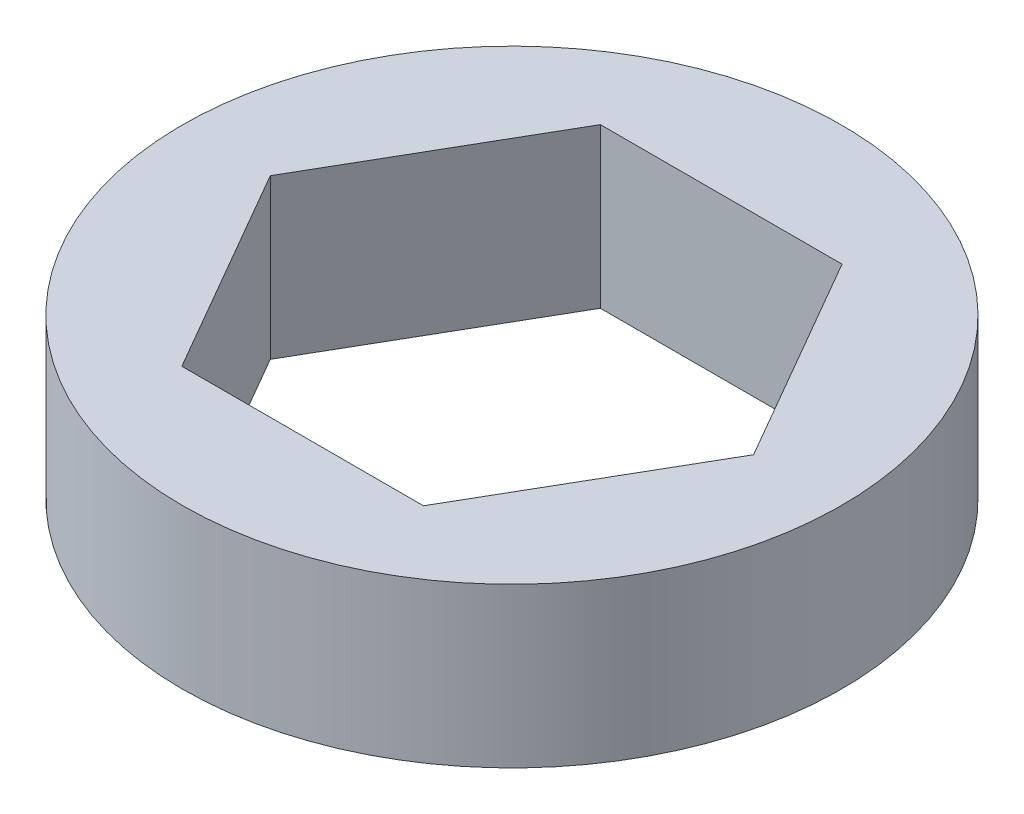
ISO-10303-21;
HEADER;
FILE_DESCRIPTION(('STEP AP214'),'2;1');
FILE_NAME('part.step','',(''),(''),'','','');
FILE_SCHEMA(('AUTOMOTIVE_DESIGN { 1 0 10303 214 1 1 1 1 }'));
ENDSEC;
DATA;
#1=APPLICATION_CONTEXT('core data for automotive mechanical design processes');
#2=APPLICATION_PROTOCOL_DEFINITION('international standard','automotive_design',2000,#1);
#3=PRODUCT_CONTEXT('',#1,'mechanical');
#4=PRODUCT('Part','Part','',(#3));
#5=PRODUCT_RELATED_PRODUCT_CATEGORY('part','',(#4));
#6=PRODUCT_DEFINITION_FORMATION('','',#4);
#7=PRODUCT_DEFINITION_CONTEXT('part definition',#1,'design');
#8=PRODUCT_DEFINITION('design','',#6,#7);
#9=PRODUCT_DEFINITION_SHAPE('','',#8);
#10=(LENGTH_UNIT() NAMED_UNIT(*) SI_UNIT(.MILLI.,.METRE.));
#11=(NAMED_UNIT(*) PLANE_ANGLE_UNIT() SI_UNIT($,.RADIAN.));
#12=(NAMED_UNIT(*) SI_UNIT($,.STERADIAN.) SOLID_ANGLE_UNIT());
#13=UNCERTAINTY_MEASURE_WITH_UNIT(LENGTH_MEASURE(1.E-05),#10,'distance_accuracy_value','');
#14=(GEOMETRIC_REPRESENTATION_CONTEXT(3) GLOBAL_UNCERTAINTY_ASSIGNED_CONTEXT((#13)) GLOBAL_UNIT_ASSIGNED_CONTEXT((#10,
#11,#12)) REPRESENTATION_CONTEXT('',''));
#15=CARTESIAN_POINT('',(0.,0.,0.));
#16=DIRECTION('',(0.,0.,1.));
#17=DIRECTION('',(1.,0.,0.));
#18=AXIS2_PLACEMENT_3D('',#15,#16,#17);
#19=CARTESIAN_POINT('',(0.,4.826,0.));
#20=DIRECTION('',(0.,1.,0.));
#21=DIRECTION('',(0.,0.,1.));
#22=AXIS2_PLACEMENT_3D('',#19,#20,#21);
#23=PLANE('',#22);
#24=CARTESIAN_POINT('',(0.,4.826,0.));
#25=DIRECTION('',(0.,1.,0.));
#26=DIRECTION('',(0.,0.,1.));
#27=AXIS2_PLACEMENT_3D('',#24,#25,#26);
#28=CIRCLE('',#27,10.);
#29=CARTESIAN_POINT('',(0.,4.826,10.));
#30=VERTEX_POINT('',#29);
#31=EDGE_CURVE('E11',#30,#30,#28,.T.);
#32=ORIENTED_EDGE('',*,*,#31,.T.);
#33=EDGE_LOOP('',(#32));
#34=FACE_BOUND('',#33,.T.);
#35=DIRECTION('',(0.5,0.,0.866025403784439));
#36=VECTOR('',#35,1.);
#37=CARTESIAN_POINT('',(-7.33234841870825,4.826,0.));
#38=LINE('',#37,#36);
#39=CARTESIAN_POINT('',(-7.33234841870825,4.826,0.));
#40=VERTEX_POINT('',#39);
#41=CARTESIAN_POINT('',(-3.66617420935413,4.826,6.35));
#42=VERTEX_POINT('',#41);
#43=EDGE_CURVE('E94',#40,#42,#38,.T.);
#44=ORIENTED_EDGE('',*,*,#43,.F.);
#45=DIRECTION('',(-0.5,0.,0.866025403784439));
#46=VECTOR('',#45,1.);
#47=CARTESIAN_POINT('',(-3.66617420935412,4.826,-6.35));
#48=LINE('',#47,#46);
#49=CARTESIAN_POINT('',(-3.66617420935412,4.826,-6.35));
#50=VERTEX_POINT('',#49);
#51=EDGE_CURVE('E86',#50,#40,#48,.T.);
#52=ORIENTED_EDGE('',*,*,#51,.F.);
#53=DIRECTION('',(-1.,0.,0.));
#54=VECTOR('',#53,1.);
#55=CARTESIAN_POINT('',(3.66617420935412,4.826,-6.35));
#56=LINE('',#55,#54);
#57=CARTESIAN_POINT('',(3.66617420935412,4.826,-6.35));
#58=VERTEX_POINT('',#57);
#59=EDGE_CURVE('E114',#58,#50,#56,.T.);
#60=ORIENTED_EDGE('',*,*,#59,.F.);
#61=DIRECTION('',(-0.5,0.,-0.866025403784439));
#62=VECTOR('',#61,1.);
#63=CARTESIAN_POINT('',(7.33234841870825,4.826,0.));
#64=LINE('',#63,#62);
#65=CARTESIAN_POINT('',(7.33234841870825,4.826,0.));
#66=VERTEX_POINT('',#65);
#67=EDGE_CURVE('E112',#66,#58,#64,.T.);
#68=ORIENTED_EDGE('',*,*,#67,.F.);
#69=DIRECTION('',(0.5,0.,-0.866025403784439));
#70=VECTOR('',#69,1.);
#71=CARTESIAN_POINT('',(3.66617420935412,4.826,6.35));
#72=LINE('',#71,#70);
#73=CARTESIAN_POINT('',(3.66617420935412,4.826,6.35));
#74=VERTEX_POINT('',#73);
#75=EDGE_CURVE('E108',#74,#66,#72,.T.);
#76=ORIENTED_EDGE('',*,*,#75,.F.);
#77=DIRECTION('',(1.,0.,0.));
#78=VECTOR('',#77,1.);
#79=CARTESIAN_POINT('',(-3.66617420935413,4.826,6.35));
#80=LINE('',#79,#78);
#81=EDGE_CURVE('E106',#42,#74,#80,.T.);
#82=ORIENTED_EDGE('',*,*,#81,.F.);
#83=EDGE_LOOP('',(#44,#52,#60,#68,#76,#82));
#84=FACE_BOUND('',#83,.T.);
#85=ADVANCED_FACE('F33',(#34,#84),#23,.T.);
#86=CARTESIAN_POINT('',(0.,0.,0.));
#87=DIRECTION('',(0.,1.,0.));
#88=DIRECTION('',(0.,0.,1.));
#89=AXIS2_PLACEMENT_3D('',#86,#87,#88);
#90=PLANE('',#89);
#91=CARTESIAN_POINT('',(0.,0.,0.));
#92=DIRECTION('',(0.,1.,0.));
#93=DIRECTION('',(0.,0.,1.));
#94=AXIS2_PLACEMENT_3D('',#91,#92,#93);
#95=CIRCLE('',#94,10.);
#96=CARTESIAN_POINT('',(0.,0.,10.));
#97=VERTEX_POINT('',#96);
#98=EDGE_CURVE('E37',#97,#97,#95,.T.);
#99=ORIENTED_EDGE('',*,*,#98,.F.);
#100=EDGE_LOOP('',(#99));
#101=FACE_BOUND('',#100,.T.);
#102=DIRECTION('',(-0.5,0.,0.866025403784439));
#103=VECTOR('',#102,1.);
#104=CARTESIAN_POINT('',(-3.66617420935412,0.,-6.35));
#105=LINE('',#104,#103);
#106=CARTESIAN_POINT('',(-3.66617420935412,0.,-6.35));
#107=VERTEX_POINT('',#106);
#108=CARTESIAN_POINT('',(-7.33234841870825,0.,0.));
#109=VERTEX_POINT('',#108);
#110=EDGE_CURVE('E56',#107,#109,#105,.T.);
#111=ORIENTED_EDGE('',*,*,#110,.T.);
#112=DIRECTION('',(0.5,0.,0.866025403784439));
#113=VECTOR('',#112,1.);
#114=CARTESIAN_POINT('',(-7.33234841870825,0.,0.));
#115=LINE('',#114,#113);
#116=CARTESIAN_POINT('',(-3.66617420935413,0.,6.35));
#117=VERTEX_POINT('',#116);
#118=EDGE_CURVE('E101',#109,#117,#115,.T.);
#119=ORIENTED_EDGE('',*,*,#118,.T.);
#120=DIRECTION('',(1.,0.,0.));
#121=VECTOR('',#120,1.);
#122=CARTESIAN_POINT('',(-3.66617420935413,0.,6.35));
#123=LINE('',#122,#121);
#124=CARTESIAN_POINT('',(3.66617420935412,0.,6.35));
#125=VERTEX_POINT('',#124);
#126=EDGE_CURVE('E118',#117,#125,#123,.T.);
#127=ORIENTED_EDGE('',*,*,#126,.T.);
#128=DIRECTION('',(0.5,0.,-0.866025403784439));
#129=VECTOR('',#128,1.);
#130=CARTESIAN_POINT('',(3.66617420935412,0.,6.35));
#131=LINE('',#130,#129);
#132=CARTESIAN_POINT('',(7.33234841870825,0.,0.));
#133=VERTEX_POINT('',#132);
#134=EDGE_CURVE('E121',#125,#133,#131,.T.);
#135=ORIENTED_EDGE('',*,*,#134,.T.);
#136=DIRECTION('',(-0.5,0.,-0.866025403784439));
#137=VECTOR('',#136,1.);
#138=CARTESIAN_POINT('',(7.33234841870825,0.,0.));
#139=LINE('',#138,#137);
#140=CARTESIAN_POINT('',(3.66617420935412,0.,-6.35));
#141=VERTEX_POINT('',#140);
#142=EDGE_CURVE('E124',#133,#141,#139,.T.);
#143=ORIENTED_EDGE('',*,*,#142,.T.);
#144=DIRECTION('',(-1.,0.,0.));
#145=VECTOR('',#144,1.);
#146=CARTESIAN_POINT('',(3.66617420935412,0.,-6.35));
#147=LINE('',#146,#145);
#148=EDGE_CURVE('E95',#141,#107,#147,.T.);
#149=ORIENTED_EDGE('',*,*,#148,.T.);
#150=EDGE_LOOP('',(#111,#119,#127,#135,#143,#149));
#151=FACE_BOUND('',#150,.T.);
#152=ADVANCED_FACE('F141',(#101,#151),#90,.F.);
#153=CARTESIAN_POINT('',(0.,4.826,0.));
#154=DIRECTION('',(0.,-1.,0.));
#155=DIRECTION('',(0.,0.,-1.));
#156=AXIS2_PLACEMENT_3D('',#153,#154,#155);
#157=CYLINDRICAL_SURFACE('',#156,10.);
#158=ORIENTED_EDGE('',*,*,#31,.F.);
#159=EDGE_LOOP('',(#158));
#160=FACE_BOUND('',#159,.T.);
#161=ORIENTED_EDGE('',*,*,#98,.T.);
#162=EDGE_LOOP('',(#161));
#163=FACE_BOUND('',#162,.T.);
#164=ADVANCED_FACE('F35',(#160,#163),#157,.T.);
#165=CARTESIAN_POINT('',(-3.66617420935412,4.826,-6.35));
#166=DIRECTION('',(0.866025403784438,0.,0.5));
#167=DIRECTION('',(0.5,0.,-0.866025403784439));
#168=AXIS2_PLACEMENT_3D('',#165,#166,#167);
#169=PLANE('',#168);
#170=ORIENTED_EDGE('',*,*,#110,.F.);
#171=DIRECTION('',(0.,-1.,0.));
#172=VECTOR('',#171,1.);
#173=CARTESIAN_POINT('',(-3.66617420935412,4.826,-6.35));
#174=LINE('',#173,#172);
#175=EDGE_CURVE('E90',#50,#107,#174,.T.);
#176=ORIENTED_EDGE('',*,*,#175,.F.);
#177=ORIENTED_EDGE('',*,*,#51,.T.);
#178=DIRECTION('',(0.,-1.,0.));
#179=VECTOR('',#178,1.);
#180=CARTESIAN_POINT('',(-7.33234841870825,4.826,0.));
#181=LINE('',#180,#179);
#182=EDGE_CURVE('E89',#40,#109,#181,.T.);
#183=ORIENTED_EDGE('',*,*,#182,.T.);
#184=EDGE_LOOP('',(#170,#176,#177,#183));
#185=FACE_BOUND('',#184,.T.);
#186=ADVANCED_FACE('F88',(#185),#169,.T.);
#187=CARTESIAN_POINT('',(-7.33234841870825,4.826,0.));
#188=DIRECTION('',(0.866025403784439,0.,-0.5));
#189=DIRECTION('',(-0.5,0.,-0.866025403784439));
#190=AXIS2_PLACEMENT_3D('',#187,#188,#189);
#191=PLANE('',#190);
#192=ORIENTED_EDGE('',*,*,#118,.F.);
#193=ORIENTED_EDGE('',*,*,#182,.F.);
#194=ORIENTED_EDGE('',*,*,#43,.T.);
#195=DIRECTION('',(0.,-1.,0.));
#196=VECTOR('',#195,1.);
#197=CARTESIAN_POINT('',(-3.66617420935413,4.826,6.35));
#198=LINE('',#197,#196);
#199=EDGE_CURVE('E102',#42,#117,#198,.T.);
#200=ORIENTED_EDGE('',*,*,#199,.T.);
#201=EDGE_LOOP('',(#192,#193,#194,#200));
#202=FACE_BOUND('',#201,.T.);
#203=ADVANCED_FACE('F98',(#202),#191,.T.);
#204=CARTESIAN_POINT('',(-3.66617420935413,4.826,6.35));
#205=DIRECTION('',(0.,0.,-1.));
#206=DIRECTION('',(-1.,0.,0.));
#207=AXIS2_PLACEMENT_3D('',#204,#205,#206);
#208=PLANE('',#207);
#209=ORIENTED_EDGE('',*,*,#126,.F.);
#210=ORIENTED_EDGE('',*,*,#199,.F.);
#211=ORIENTED_EDGE('',*,*,#81,.T.);
#212=DIRECTION('',(0.,-1.,0.));
#213=VECTOR('',#212,1.);
#214=CARTESIAN_POINT('',(3.66617420935412,4.826,6.35));
#215=LINE('',#214,#213);
#216=EDGE_CURVE('E133',#74,#125,#215,.T.);
#217=ORIENTED_EDGE('',*,*,#216,.T.);
#218=EDGE_LOOP('',(#209,#210,#211,#217));
#219=FACE_BOUND('',#218,.T.);
#220=ADVANCED_FACE('F137',(#219),#208,.T.);
#221=CARTESIAN_POINT('',(3.66617420935412,4.826,6.35));
#222=DIRECTION('',(-0.866025403784439,0.,-0.5));
#223=DIRECTION('',(-0.5,0.,0.866025403784439));
#224=AXIS2_PLACEMENT_3D('',#221,#222,#223);
#225=PLANE('',#224);
#226=ORIENTED_EDGE('',*,*,#134,.F.);
#227=ORIENTED_EDGE('',*,*,#216,.F.);
#228=ORIENTED_EDGE('',*,*,#75,.T.);
#229=DIRECTION('',(0.,-1.,0.));
#230=VECTOR('',#229,1.);
#231=CARTESIAN_POINT('',(7.33234841870825,4.826,0.));
#232=LINE('',#231,#230);
#233=EDGE_CURVE('E131',#66,#133,#232,.T.);
#234=ORIENTED_EDGE('',*,*,#233,.T.);
#235=EDGE_LOOP('',(#226,#227,#228,#234));
#236=FACE_BOUND('',#235,.T.);
#237=ADVANCED_FACE('F149',(#236),#225,.T.);
#238=CARTESIAN_POINT('',(7.33234841870825,4.826,0.));
#239=DIRECTION('',(-0.866025403784439,0.,0.5));
#240=DIRECTION('',(0.5,0.,0.866025403784439));
#241=AXIS2_PLACEMENT_3D('',#238,#239,#240);
#242=PLANE('',#241);
#243=ORIENTED_EDGE('',*,*,#142,.F.);
#244=ORIENTED_EDGE('',*,*,#233,.F.);
#245=ORIENTED_EDGE('',*,*,#67,.T.);
#246=DIRECTION('',(0.,-1.,0.));
#247=VECTOR('',#246,1.);
#248=CARTESIAN_POINT('',(3.66617420935412,4.826,-6.35));
#249=LINE('',#248,#247);
#250=EDGE_CURVE('E48',#58,#141,#249,.T.);
#251=ORIENTED_EDGE('',*,*,#250,.T.);
#252=EDGE_LOOP('',(#243,#244,#245,#251));
#253=FACE_BOUND('',#252,.T.);
#254=ADVANCED_FACE('F147',(#253),#242,.T.);
#255=CARTESIAN_POINT('',(3.66617420935412,4.826,-6.35));
#256=DIRECTION('',(0.,0.,1.));
#257=DIRECTION('',(1.,0.,0.));
#258=AXIS2_PLACEMENT_3D('',#255,#256,#257);
#259=PLANE('',#258);
#260=ORIENTED_EDGE('',*,*,#148,.F.);
#261=ORIENTED_EDGE('',*,*,#250,.F.);
#262=ORIENTED_EDGE('',*,*,#59,.T.);
#263=ORIENTED_EDGE('',*,*,#175,.T.);
#264=EDGE_LOOP('',(#260,#261,#262,#263));
#265=FACE_BOUND('',#264,.T.);
#266=ADVANCED_FACE('F143',(#265),#259,.T.);
#267=CLOSED_SHELL('',(#85,#152,#164,#186,#203,#220,#237,#254,#266));
#268=MANIFOLD_SOLID_BREP('B2',#267);
#269=ADVANCED_BREP_SHAPE_REPRESENTATION('',(#18,#268),#14);
#270=SHAPE_DEFINITION_REPRESENTATION(#9,#269);
ENDSEC;
END-ISO-10303-21;
